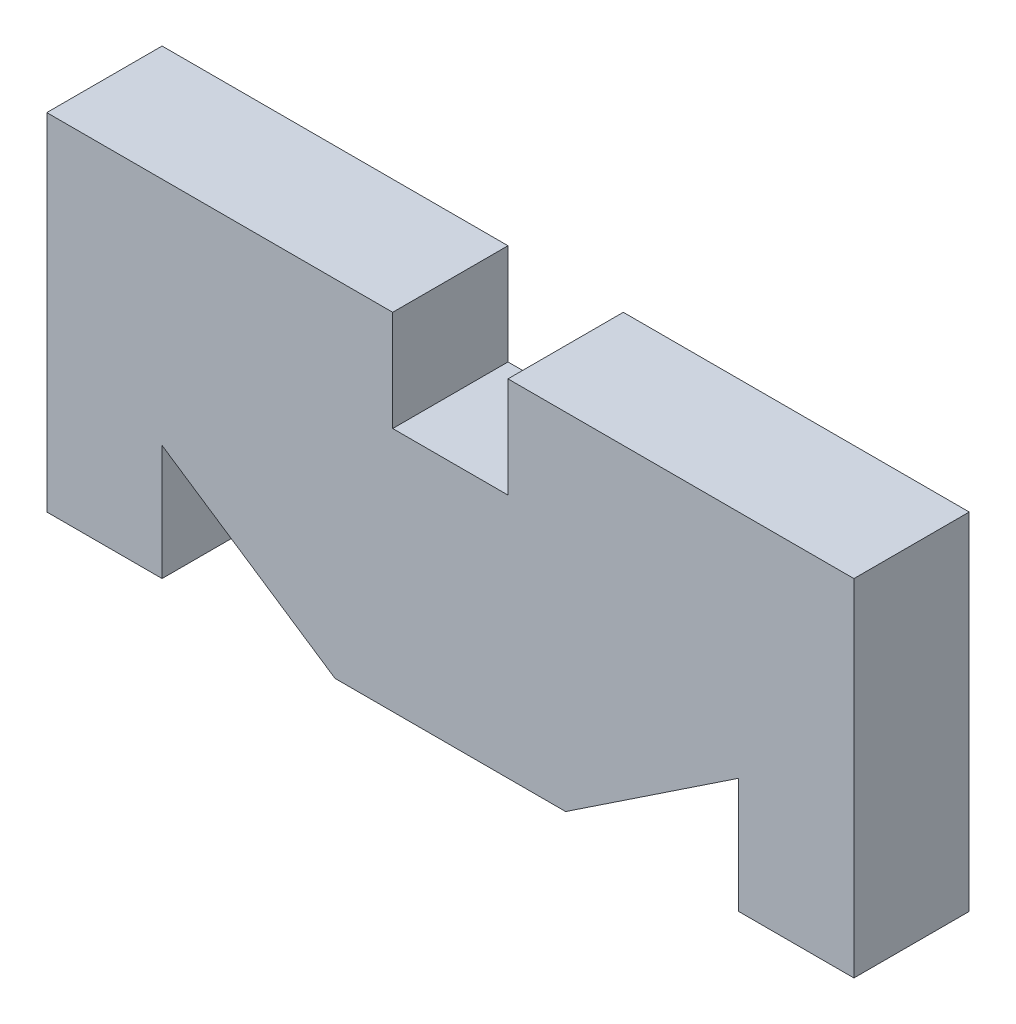
ISO-10303-21;
HEADER;
FILE_DESCRIPTION(('STEP AP214'),'2;1');
FILE_NAME('part.step','',(''),(''),'','','');
FILE_SCHEMA(('AUTOMOTIVE_DESIGN { 1 0 10303 214 1 1 1 1 }'));
ENDSEC;
DATA;
#1=APPLICATION_CONTEXT('core data for automotive mechanical design processes');
#2=APPLICATION_PROTOCOL_DEFINITION('international standard','automotive_design',2000,#1);
#3=PRODUCT_CONTEXT('',#1,'mechanical');
#4=PRODUCT('Part','Part','',(#3));
#5=PRODUCT_RELATED_PRODUCT_CATEGORY('part','',(#4));
#6=PRODUCT_DEFINITION_FORMATION('','',#4);
#7=PRODUCT_DEFINITION_CONTEXT('part definition',#1,'design');
#8=PRODUCT_DEFINITION('design','',#6,#7);
#9=PRODUCT_DEFINITION_SHAPE('','',#8);
#10=(LENGTH_UNIT() NAMED_UNIT(*) SI_UNIT(.MILLI.,.METRE.));
#11=(NAMED_UNIT(*) PLANE_ANGLE_UNIT() SI_UNIT($,.RADIAN.));
#12=(NAMED_UNIT(*) SI_UNIT($,.STERADIAN.) SOLID_ANGLE_UNIT());
#13=UNCERTAINTY_MEASURE_WITH_UNIT(LENGTH_MEASURE(1.E-05),#10,'distance_accuracy_value','');
#14=(GEOMETRIC_REPRESENTATION_CONTEXT(3) GLOBAL_UNCERTAINTY_ASSIGNED_CONTEXT((#13)) GLOBAL_UNIT_ASSIGNED_CONTEXT((#10,
#11,#12)) REPRESENTATION_CONTEXT('',''));
#15=CARTESIAN_POINT('',(0.,0.,0.));
#16=DIRECTION('',(0.,0.,1.));
#17=DIRECTION('',(1.,0.,0.));
#18=AXIS2_PLACEMENT_3D('',#15,#16,#17);
#19=CARTESIAN_POINT('',(-35.0374750143182,19.,10.));
#20=DIRECTION('',(1.,0.,0.));
#21=DIRECTION('',(0.,0.,-1.));
#22=AXIS2_PLACEMENT_3D('',#19,#20,#21);
#23=PLANE('',#22);
#24=DIRECTION('',(0.,-1.,0.));
#25=VECTOR('',#24,1.);
#26=CARTESIAN_POINT('',(-35.0374750143182,19.,0.));
#27=LINE('',#26,#25);
#28=CARTESIAN_POINT('',(-35.0374750143182,19.,0.));
#29=VERTEX_POINT('',#28);
#30=CARTESIAN_POINT('',(-35.0374750143182,-11.,0.));
#31=VERTEX_POINT('',#30);
#32=EDGE_CURVE('E167',#29,#31,#27,.T.);
#33=ORIENTED_EDGE('',*,*,#32,.T.);
#34=DIRECTION('',(0.,0.,-1.));
#35=VECTOR('',#34,1.);
#36=CARTESIAN_POINT('',(-35.0374750143182,-11.,10.));
#37=LINE('',#36,#35);
#38=CARTESIAN_POINT('',(-35.0374750143182,-11.,10.));
#39=VERTEX_POINT('',#38);
#40=EDGE_CURVE('E11',#39,#31,#37,.T.);
#41=ORIENTED_EDGE('',*,*,#40,.F.);
#42=DIRECTION('',(0.,-1.,0.));
#43=VECTOR('',#42,1.);
#44=CARTESIAN_POINT('',(-35.0374750143182,19.,10.));
#45=LINE('',#44,#43);
#46=CARTESIAN_POINT('',(-35.0374750143182,19.,10.));
#47=VERTEX_POINT('',#46);
#48=EDGE_CURVE('E193',#47,#39,#45,.T.);
#49=ORIENTED_EDGE('',*,*,#48,.F.);
#50=DIRECTION('',(0.,0.,-1.));
#51=VECTOR('',#50,1.);
#52=CARTESIAN_POINT('',(-35.0374750143182,19.,10.));
#53=LINE('',#52,#51);
#54=EDGE_CURVE('E163',#47,#29,#53,.T.);
#55=ORIENTED_EDGE('',*,*,#54,.T.);
#56=EDGE_LOOP('',(#33,#41,#49,#55));
#57=FACE_BOUND('',#56,.T.);
#58=ADVANCED_FACE('F35',(#57),#23,.F.);
#59=CARTESIAN_POINT('',(-35.0374750143182,-11.,10.));
#60=DIRECTION('',(0.,1.,0.));
#61=DIRECTION('',(0.,0.,1.));
#62=AXIS2_PLACEMENT_3D('',#59,#60,#61);
#63=PLANE('',#62);
#64=DIRECTION('',(1.,0.,0.));
#65=VECTOR('',#64,1.);
#66=CARTESIAN_POINT('',(-35.0374750143182,-11.,0.));
#67=LINE('',#66,#65);
#68=CARTESIAN_POINT('',(-25.0374750143182,-11.,0.));
#69=VERTEX_POINT('',#68);
#70=EDGE_CURVE('E170',#31,#69,#67,.T.);
#71=ORIENTED_EDGE('',*,*,#70,.T.);
#72=DIRECTION('',(0.,0.,-1.));
#73=VECTOR('',#72,1.);
#74=CARTESIAN_POINT('',(-25.0374750143182,-11.,10.));
#75=LINE('',#74,#73);
#76=CARTESIAN_POINT('',(-25.0374750143182,-11.,10.));
#77=VERTEX_POINT('',#76);
#78=EDGE_CURVE('E43',#77,#69,#75,.T.);
#79=ORIENTED_EDGE('',*,*,#78,.F.);
#80=DIRECTION('',(1.,0.,0.));
#81=VECTOR('',#80,1.);
#82=CARTESIAN_POINT('',(-35.0374750143182,-11.,10.));
#83=LINE('',#82,#81);
#84=EDGE_CURVE('E112',#39,#77,#83,.T.);
#85=ORIENTED_EDGE('',*,*,#84,.F.);
#86=ORIENTED_EDGE('',*,*,#40,.T.);
#87=EDGE_LOOP('',(#71,#79,#85,#86));
#88=FACE_BOUND('',#87,.T.);
#89=ADVANCED_FACE('F281',(#88),#63,.F.);
#90=CARTESIAN_POINT('',(-25.0374750143182,-11.,10.));
#91=DIRECTION('',(-1.,0.,0.));
#92=DIRECTION('',(0.,0.,1.));
#93=AXIS2_PLACEMENT_3D('',#90,#91,#92);
#94=PLANE('',#93);
#95=DIRECTION('',(0.,1.,0.));
#96=VECTOR('',#95,1.);
#97=CARTESIAN_POINT('',(-25.0374750143182,-11.,0.));
#98=LINE('',#97,#96);
#99=CARTESIAN_POINT('',(-25.0374750143182,-0.999999999999996,0.));
#100=VERTEX_POINT('',#99);
#101=EDGE_CURVE('E172',#69,#100,#98,.T.);
#102=ORIENTED_EDGE('',*,*,#101,.T.);
#103=DIRECTION('',(0.,0.,-1.));
#104=VECTOR('',#103,1.);
#105=CARTESIAN_POINT('',(-25.0374750143182,-0.999999999999996,10.));
#106=LINE('',#105,#104);
#107=CARTESIAN_POINT('',(-25.0374750143182,-0.999999999999996,10.));
#108=VERTEX_POINT('',#107);
#109=EDGE_CURVE('E218',#108,#100,#106,.T.);
#110=ORIENTED_EDGE('',*,*,#109,.F.);
#111=DIRECTION('',(0.,1.,0.));
#112=VECTOR('',#111,1.);
#113=CARTESIAN_POINT('',(-25.0374750143182,-11.,10.));
#114=LINE('',#113,#112);
#115=EDGE_CURVE('E226',#77,#108,#114,.T.);
#116=ORIENTED_EDGE('',*,*,#115,.F.);
#117=ORIENTED_EDGE('',*,*,#78,.T.);
#118=EDGE_LOOP('',(#102,#110,#116,#117));
#119=FACE_BOUND('',#118,.T.);
#120=ADVANCED_FACE('F224',(#119),#94,.F.);
#121=CARTESIAN_POINT('',(-25.0374750143182,-0.999999999999996,10.));
#122=DIRECTION('',(0.554700196225229,0.832050294337844,0.));
#123=DIRECTION('',(-0.832050294337844,0.554700196225229,0.));
#124=AXIS2_PLACEMENT_3D('',#121,#122,#123);
#125=PLANE('',#124);
#126=DIRECTION('',(0.832050294337844,-0.554700196225229,0.));
#127=VECTOR('',#126,1.);
#128=CARTESIAN_POINT('',(-25.0374750143182,-0.999999999999996,0.));
#129=LINE('',#128,#127);
#130=CARTESIAN_POINT('',(-10.0374750143182,-11.,0.));
#131=VERTEX_POINT('',#130);
#132=EDGE_CURVE('E174',#100,#131,#129,.T.);
#133=ORIENTED_EDGE('',*,*,#132,.T.);
#134=DIRECTION('',(0.,0.,-1.));
#135=VECTOR('',#134,1.);
#136=CARTESIAN_POINT('',(-10.0374750143182,-11.,10.));
#137=LINE('',#136,#135);
#138=CARTESIAN_POINT('',(-10.0374750143182,-11.,10.));
#139=VERTEX_POINT('',#138);
#140=EDGE_CURVE('E215',#139,#131,#137,.T.);
#141=ORIENTED_EDGE('',*,*,#140,.F.);
#142=DIRECTION('',(0.832050294337844,-0.554700196225229,0.));
#143=VECTOR('',#142,1.);
#144=CARTESIAN_POINT('',(-25.0374750143182,-0.999999999999996,10.));
#145=LINE('',#144,#143);
#146=EDGE_CURVE('E244',#108,#139,#145,.T.);
#147=ORIENTED_EDGE('',*,*,#146,.F.);
#148=ORIENTED_EDGE('',*,*,#109,.T.);
#149=EDGE_LOOP('',(#133,#141,#147,#148));
#150=FACE_BOUND('',#149,.T.);
#151=ADVANCED_FACE('F235',(#150),#125,.F.);
#152=CARTESIAN_POINT('',(-10.0374750143182,-11.,10.));
#153=DIRECTION('',(0.,1.,0.));
#154=DIRECTION('',(0.,0.,1.));
#155=AXIS2_PLACEMENT_3D('',#152,#153,#154);
#156=PLANE('',#155);
#157=DIRECTION('',(1.,0.,0.));
#158=VECTOR('',#157,1.);
#159=CARTESIAN_POINT('',(-10.0374750143182,-11.,0.));
#160=LINE('',#159,#158);
#161=CARTESIAN_POINT('',(9.96252498568179,-11.,0.));
#162=VERTEX_POINT('',#161);
#163=EDGE_CURVE('E176',#131,#162,#160,.T.);
#164=ORIENTED_EDGE('',*,*,#163,.T.);
#165=DIRECTION('',(0.,0.,-1.));
#166=VECTOR('',#165,1.);
#167=CARTESIAN_POINT('',(9.96252498568179,-11.,10.));
#168=LINE('',#167,#166);
#169=CARTESIAN_POINT('',(9.96252498568179,-11.,10.));
#170=VERTEX_POINT('',#169);
#171=EDGE_CURVE('E212',#170,#162,#168,.T.);
#172=ORIENTED_EDGE('',*,*,#171,.F.);
#173=DIRECTION('',(1.,0.,0.));
#174=VECTOR('',#173,1.);
#175=CARTESIAN_POINT('',(-10.0374750143182,-11.,10.));
#176=LINE('',#175,#174);
#177=EDGE_CURVE('E241',#139,#170,#176,.T.);
#178=ORIENTED_EDGE('',*,*,#177,.F.);
#179=ORIENTED_EDGE('',*,*,#140,.T.);
#180=EDGE_LOOP('',(#164,#172,#178,#179));
#181=FACE_BOUND('',#180,.T.);
#182=ADVANCED_FACE('F239',(#181),#156,.F.);
#183=CARTESIAN_POINT('',(24.9625249856818,-0.999999999999996,10.));
#184=DIRECTION('',(-0.554700196225229,0.832050294337844,0.));
#185=DIRECTION('',(-0.832050294337844,-0.554700196225229,0.));
#186=AXIS2_PLACEMENT_3D('',#183,#184,#185);
#187=PLANE('',#186);
#188=DIRECTION('',(0.832050294337844,0.554700196225229,0.));
#189=VECTOR('',#188,1.);
#190=CARTESIAN_POINT('',(24.9625249856818,-0.999999999999996,0.));
#191=LINE('',#190,#189);
#192=CARTESIAN_POINT('',(24.9625249856818,-0.999999999999996,0.));
#193=VERTEX_POINT('',#192);
#194=EDGE_CURVE('E178',#162,#193,#191,.T.);
#195=ORIENTED_EDGE('',*,*,#194,.T.);
#196=DIRECTION('',(0.,0.,-1.));
#197=VECTOR('',#196,1.);
#198=CARTESIAN_POINT('',(24.9625249856818,-0.999999999999996,10.));
#199=LINE('',#198,#197);
#200=CARTESIAN_POINT('',(24.9625249856818,-0.999999999999996,10.));
#201=VERTEX_POINT('',#200);
#202=EDGE_CURVE('E209',#201,#193,#199,.T.);
#203=ORIENTED_EDGE('',*,*,#202,.F.);
#204=DIRECTION('',(0.832050294337844,0.554700196225229,0.));
#205=VECTOR('',#204,1.);
#206=CARTESIAN_POINT('',(24.9625249856818,-0.999999999999996,10.));
#207=LINE('',#206,#205);
#208=EDGE_CURVE('E243',#170,#201,#207,.T.);
#209=ORIENTED_EDGE('',*,*,#208,.F.);
#210=ORIENTED_EDGE('',*,*,#171,.T.);
#211=EDGE_LOOP('',(#195,#203,#209,#210));
#212=FACE_BOUND('',#211,.T.);
#213=ADVANCED_FACE('F294',(#212),#187,.F.);
#214=CARTESIAN_POINT('',(24.9625249856818,-11.,10.));
#215=DIRECTION('',(1.,0.,0.));
#216=DIRECTION('',(0.,0.,-1.));
#217=AXIS2_PLACEMENT_3D('',#214,#215,#216);
#218=PLANE('',#217);
#219=DIRECTION('',(0.,-1.,0.));
#220=VECTOR('',#219,1.);
#221=CARTESIAN_POINT('',(24.9625249856818,-11.,0.));
#222=LINE('',#221,#220);
#223=CARTESIAN_POINT('',(24.9625249856818,-11.,0.));
#224=VERTEX_POINT('',#223);
#225=EDGE_CURVE('E180',#193,#224,#222,.T.);
#226=ORIENTED_EDGE('',*,*,#225,.T.);
#227=DIRECTION('',(0.,0.,-1.));
#228=VECTOR('',#227,1.);
#229=CARTESIAN_POINT('',(24.9625249856818,-11.,10.));
#230=LINE('',#229,#228);
#231=CARTESIAN_POINT('',(24.9625249856818,-11.,10.));
#232=VERTEX_POINT('',#231);
#233=EDGE_CURVE('E206',#232,#224,#230,.T.);
#234=ORIENTED_EDGE('',*,*,#233,.F.);
#235=DIRECTION('',(0.,-1.,0.));
#236=VECTOR('',#235,1.);
#237=CARTESIAN_POINT('',(24.9625249856818,-11.,10.));
#238=LINE('',#237,#236);
#239=EDGE_CURVE('E246',#201,#232,#238,.T.);
#240=ORIENTED_EDGE('',*,*,#239,.F.);
#241=ORIENTED_EDGE('',*,*,#202,.T.);
#242=EDGE_LOOP('',(#226,#234,#240,#241));
#243=FACE_BOUND('',#242,.T.);
#244=ADVANCED_FACE('F297',(#243),#218,.F.);
#245=CARTESIAN_POINT('',(24.9625249856818,-11.,10.));
#246=DIRECTION('',(0.,1.,0.));
#247=DIRECTION('',(0.,0.,1.));
#248=AXIS2_PLACEMENT_3D('',#245,#246,#247);
#249=PLANE('',#248);
#250=DIRECTION('',(1.,0.,0.));
#251=VECTOR('',#250,1.);
#252=CARTESIAN_POINT('',(24.9625249856818,-11.,0.));
#253=LINE('',#252,#251);
#254=CARTESIAN_POINT('',(34.9625249856818,-11.,0.));
#255=VERTEX_POINT('',#254);
#256=EDGE_CURVE('E182',#224,#255,#253,.T.);
#257=ORIENTED_EDGE('',*,*,#256,.T.);
#258=DIRECTION('',(0.,0.,-1.));
#259=VECTOR('',#258,1.);
#260=CARTESIAN_POINT('',(34.9625249856818,-11.,10.));
#261=LINE('',#260,#259);
#262=CARTESIAN_POINT('',(34.9625249856818,-11.,10.));
#263=VERTEX_POINT('',#262);
#264=EDGE_CURVE('E203',#263,#255,#261,.T.);
#265=ORIENTED_EDGE('',*,*,#264,.F.);
#266=DIRECTION('',(1.,0.,0.));
#267=VECTOR('',#266,1.);
#268=CARTESIAN_POINT('',(24.9625249856818,-11.,10.));
#269=LINE('',#268,#267);
#270=EDGE_CURVE('E252',#232,#263,#269,.T.);
#271=ORIENTED_EDGE('',*,*,#270,.F.);
#272=ORIENTED_EDGE('',*,*,#233,.T.);
#273=EDGE_LOOP('',(#257,#265,#271,#272));
#274=FACE_BOUND('',#273,.T.);
#275=ADVANCED_FACE('F301',(#274),#249,.F.);
#276=CARTESIAN_POINT('',(34.9625249856818,19.,10.));
#277=DIRECTION('',(-1.,0.,0.));
#278=DIRECTION('',(0.,-1.,0.));
#279=AXIS2_PLACEMENT_3D('',#276,#277,#278);
#280=PLANE('',#279);
#281=DIRECTION('',(0.,1.,0.));
#282=VECTOR('',#281,1.);
#283=CARTESIAN_POINT('',(34.9625249856818,19.,0.));
#284=LINE('',#283,#282);
#285=CARTESIAN_POINT('',(34.9625249856818,19.,0.));
#286=VERTEX_POINT('',#285);
#287=EDGE_CURVE('E184',#255,#286,#284,.T.);
#288=ORIENTED_EDGE('',*,*,#287,.T.);
#289=DIRECTION('',(0.,0.,-1.));
#290=VECTOR('',#289,1.);
#291=CARTESIAN_POINT('',(34.9625249856818,19.,10.));
#292=LINE('',#291,#290);
#293=CARTESIAN_POINT('',(34.9625249856818,19.,10.));
#294=VERTEX_POINT('',#293);
#295=EDGE_CURVE('E200',#294,#286,#292,.T.);
#296=ORIENTED_EDGE('',*,*,#295,.F.);
#297=DIRECTION('',(0.,1.,0.));
#298=VECTOR('',#297,1.);
#299=CARTESIAN_POINT('',(34.9625249856818,19.,10.));
#300=LINE('',#299,#298);
#301=EDGE_CURVE('E254',#263,#294,#300,.T.);
#302=ORIENTED_EDGE('',*,*,#301,.F.);
#303=ORIENTED_EDGE('',*,*,#264,.T.);
#304=EDGE_LOOP('',(#288,#296,#302,#303));
#305=FACE_BOUND('',#304,.T.);
#306=ADVANCED_FACE('F305',(#305),#280,.F.);
#307=CARTESIAN_POINT('',(4.96252498568178,19.,10.));
#308=DIRECTION('',(0.,-1.,0.));
#309=DIRECTION('',(0.,0.,-1.));
#310=AXIS2_PLACEMENT_3D('',#307,#308,#309);
#311=PLANE('',#310);
#312=DIRECTION('',(-1.,0.,0.));
#313=VECTOR('',#312,1.);
#314=CARTESIAN_POINT('',(4.96252498568178,19.,0.));
#315=LINE('',#314,#313);
#316=CARTESIAN_POINT('',(4.96252498568178,19.,0.));
#317=VERTEX_POINT('',#316);
#318=EDGE_CURVE('E186',#286,#317,#315,.T.);
#319=ORIENTED_EDGE('',*,*,#318,.T.);
#320=DIRECTION('',(0.,0.,-1.));
#321=VECTOR('',#320,1.);
#322=CARTESIAN_POINT('',(4.96252498568178,19.,10.));
#323=LINE('',#322,#321);
#324=CARTESIAN_POINT('',(4.96252498568178,19.,10.));
#325=VERTEX_POINT('',#324);
#326=EDGE_CURVE('E197',#325,#317,#323,.T.);
#327=ORIENTED_EDGE('',*,*,#326,.F.);
#328=DIRECTION('',(-1.,0.,0.));
#329=VECTOR('',#328,1.);
#330=CARTESIAN_POINT('',(4.96252498568178,19.,10.));
#331=LINE('',#330,#329);
#332=EDGE_CURVE('E256',#294,#325,#331,.T.);
#333=ORIENTED_EDGE('',*,*,#332,.F.);
#334=ORIENTED_EDGE('',*,*,#295,.T.);
#335=EDGE_LOOP('',(#319,#327,#333,#334));
#336=FACE_BOUND('',#335,.T.);
#337=ADVANCED_FACE('F262',(#336),#311,.F.);
#338=CARTESIAN_POINT('',(4.96252498568178,10.2697729322163,10.));
#339=DIRECTION('',(1.,0.,0.));
#340=DIRECTION('',(0.,0.,-1.));
#341=AXIS2_PLACEMENT_3D('',#338,#339,#340);
#342=PLANE('',#341);
#343=DIRECTION('',(0.,-1.,0.));
#344=VECTOR('',#343,1.);
#345=CARTESIAN_POINT('',(4.96252498568178,10.2697729322163,0.));
#346=LINE('',#345,#344);
#347=CARTESIAN_POINT('',(4.96252498568178,10.2697729322163,0.));
#348=VERTEX_POINT('',#347);
#349=EDGE_CURVE('E188',#317,#348,#346,.T.);
#350=ORIENTED_EDGE('',*,*,#349,.T.);
#351=DIRECTION('',(0.,0.,-1.));
#352=VECTOR('',#351,1.);
#353=CARTESIAN_POINT('',(4.96252498568178,10.2697729322163,10.));
#354=LINE('',#353,#352);
#355=CARTESIAN_POINT('',(4.96252498568178,10.2697729322163,10.));
#356=VERTEX_POINT('',#355);
#357=EDGE_CURVE('E158',#356,#348,#354,.T.);
#358=ORIENTED_EDGE('',*,*,#357,.F.);
#359=DIRECTION('',(0.,-1.,0.));
#360=VECTOR('',#359,1.);
#361=CARTESIAN_POINT('',(4.96252498568178,10.2697729322163,10.));
#362=LINE('',#361,#360);
#363=EDGE_CURVE('E149',#325,#356,#362,.T.);
#364=ORIENTED_EDGE('',*,*,#363,.F.);
#365=ORIENTED_EDGE('',*,*,#326,.T.);
#366=EDGE_LOOP('',(#350,#358,#364,#365));
#367=FACE_BOUND('',#366,.T.);
#368=ADVANCED_FACE('F266',(#367),#342,.F.);
#369=CARTESIAN_POINT('',(-5.03747501431822,10.2697729322163,10.));
#370=DIRECTION('',(0.,-1.,0.));
#371=DIRECTION('',(0.,0.,-1.));
#372=AXIS2_PLACEMENT_3D('',#369,#370,#371);
#373=PLANE('',#372);
#374=DIRECTION('',(-1.,0.,0.));
#375=VECTOR('',#374,1.);
#376=CARTESIAN_POINT('',(-5.03747501431822,10.2697729322163,0.));
#377=LINE('',#376,#375);
#378=CARTESIAN_POINT('',(-5.03747501431822,10.2697729322163,0.));
#379=VERTEX_POINT('',#378);
#380=EDGE_CURVE('E157',#348,#379,#377,.T.);
#381=ORIENTED_EDGE('',*,*,#380,.T.);
#382=DIRECTION('',(0.,0.,-1.));
#383=VECTOR('',#382,1.);
#384=CARTESIAN_POINT('',(-5.03747501431822,10.2697729322163,10.));
#385=LINE('',#384,#383);
#386=CARTESIAN_POINT('',(-5.03747501431822,10.2697729322163,10.));
#387=VERTEX_POINT('',#386);
#388=EDGE_CURVE('E154',#387,#379,#385,.T.);
#389=ORIENTED_EDGE('',*,*,#388,.F.);
#390=DIRECTION('',(-1.,0.,0.));
#391=VECTOR('',#390,1.);
#392=CARTESIAN_POINT('',(-5.03747501431822,10.2697729322163,10.));
#393=LINE('',#392,#391);
#394=EDGE_CURVE('E143',#356,#387,#393,.T.);
#395=ORIENTED_EDGE('',*,*,#394,.F.);
#396=ORIENTED_EDGE('',*,*,#357,.T.);
#397=EDGE_LOOP('',(#381,#389,#395,#396));
#398=FACE_BOUND('',#397,.T.);
#399=ADVANCED_FACE('F155',(#398),#373,.F.);
#400=CARTESIAN_POINT('',(-5.03747501431822,19.,10.));
#401=DIRECTION('',(-1.,0.,0.));
#402=DIRECTION('',(0.,-1.,0.));
#403=AXIS2_PLACEMENT_3D('',#400,#401,#402);
#404=PLANE('',#403);
#405=DIRECTION('',(0.,1.,0.));
#406=VECTOR('',#405,1.);
#407=CARTESIAN_POINT('',(-5.03747501431822,19.,0.));
#408=LINE('',#407,#406);
#409=CARTESIAN_POINT('',(-5.03747501431822,19.,0.));
#410=VERTEX_POINT('',#409);
#411=EDGE_CURVE('E98',#379,#410,#408,.T.);
#412=ORIENTED_EDGE('',*,*,#411,.T.);
#413=DIRECTION('',(0.,0.,-1.));
#414=VECTOR('',#413,1.);
#415=CARTESIAN_POINT('',(-5.03747501431822,19.,10.));
#416=LINE('',#415,#414);
#417=CARTESIAN_POINT('',(-5.03747501431822,19.,10.));
#418=VERTEX_POINT('',#417);
#419=EDGE_CURVE('E159',#418,#410,#416,.T.);
#420=ORIENTED_EDGE('',*,*,#419,.F.);
#421=DIRECTION('',(0.,1.,0.));
#422=VECTOR('',#421,1.);
#423=CARTESIAN_POINT('',(-5.03747501431822,19.,10.));
#424=LINE('',#423,#422);
#425=EDGE_CURVE('E147',#387,#418,#424,.T.);
#426=ORIENTED_EDGE('',*,*,#425,.F.);
#427=ORIENTED_EDGE('',*,*,#388,.T.);
#428=EDGE_LOOP('',(#412,#420,#426,#427));
#429=FACE_BOUND('',#428,.T.);
#430=ADVANCED_FACE('F161',(#429),#404,.F.);
#431=CARTESIAN_POINT('',(-35.0374750143182,19.,10.));
#432=DIRECTION('',(0.,-1.,0.));
#433=DIRECTION('',(0.,0.,-1.));
#434=AXIS2_PLACEMENT_3D('',#431,#432,#433);
#435=PLANE('',#434);
#436=DIRECTION('',(-1.,0.,0.));
#437=VECTOR('',#436,1.);
#438=CARTESIAN_POINT('',(-35.0374750143182,19.,0.));
#439=LINE('',#438,#437);
#440=EDGE_CURVE('E104',#410,#29,#439,.T.);
#441=ORIENTED_EDGE('',*,*,#440,.T.);
#442=ORIENTED_EDGE('',*,*,#54,.F.);
#443=DIRECTION('',(-1.,0.,0.));
#444=VECTOR('',#443,1.);
#445=CARTESIAN_POINT('',(-35.0374750143182,19.,10.));
#446=LINE('',#445,#444);
#447=EDGE_CURVE('E51',#418,#47,#446,.T.);
#448=ORIENTED_EDGE('',*,*,#447,.F.);
#449=ORIENTED_EDGE('',*,*,#419,.T.);
#450=EDGE_LOOP('',(#441,#442,#448,#449));
#451=FACE_BOUND('',#450,.T.);
#452=ADVANCED_FACE('F270',(#451),#435,.F.);
#453=CARTESIAN_POINT('',(0.,0.,10.));
#454=DIRECTION('',(0.,0.,1.));
#455=DIRECTION('',(1.,0.,0.));
#456=AXIS2_PLACEMENT_3D('',#453,#454,#455);
#457=PLANE('',#456);
#458=ORIENTED_EDGE('',*,*,#48,.T.);
#459=ORIENTED_EDGE('',*,*,#84,.T.);
#460=ORIENTED_EDGE('',*,*,#115,.T.);
#461=ORIENTED_EDGE('',*,*,#146,.T.);
#462=ORIENTED_EDGE('',*,*,#177,.T.);
#463=ORIENTED_EDGE('',*,*,#208,.T.);
#464=ORIENTED_EDGE('',*,*,#239,.T.);
#465=ORIENTED_EDGE('',*,*,#270,.T.);
#466=ORIENTED_EDGE('',*,*,#301,.T.);
#467=ORIENTED_EDGE('',*,*,#332,.T.);
#468=ORIENTED_EDGE('',*,*,#363,.T.);
#469=ORIENTED_EDGE('',*,*,#394,.T.);
#470=ORIENTED_EDGE('',*,*,#425,.T.);
#471=ORIENTED_EDGE('',*,*,#447,.T.);
#472=EDGE_LOOP('',(#458,#459,#460,#461,#462,#463,#464,#465,#466,#467,#468,#469,#470,#471));
#473=FACE_BOUND('',#472,.T.);
#474=ADVANCED_FACE('F145',(#473),#457,.T.);
#475=CARTESIAN_POINT('',(0.,0.,0.));
#476=DIRECTION('',(0.,0.,1.));
#477=DIRECTION('',(1.,0.,0.));
#478=AXIS2_PLACEMENT_3D('',#475,#476,#477);
#479=PLANE('',#478);
#480=ORIENTED_EDGE('',*,*,#32,.F.);
#481=ORIENTED_EDGE('',*,*,#440,.F.);
#482=ORIENTED_EDGE('',*,*,#411,.F.);
#483=ORIENTED_EDGE('',*,*,#380,.F.);
#484=ORIENTED_EDGE('',*,*,#349,.F.);
#485=ORIENTED_EDGE('',*,*,#318,.F.);
#486=ORIENTED_EDGE('',*,*,#287,.F.);
#487=ORIENTED_EDGE('',*,*,#256,.F.);
#488=ORIENTED_EDGE('',*,*,#225,.F.);
#489=ORIENTED_EDGE('',*,*,#194,.F.);
#490=ORIENTED_EDGE('',*,*,#163,.F.);
#491=ORIENTED_EDGE('',*,*,#132,.F.);
#492=ORIENTED_EDGE('',*,*,#101,.F.);
#493=ORIENTED_EDGE('',*,*,#70,.F.);
#494=EDGE_LOOP('',(#480,#481,#482,#483,#484,#485,#486,#487,#488,#489,#490,#491,#492,#493));
#495=FACE_BOUND('',#494,.T.);
#496=ADVANCED_FACE('F230',(#495),#479,.F.);
#497=CLOSED_SHELL('',(#58,#89,#120,#151,#182,#213,#244,#275,#306,#337,#368,#399,#430,#452,#474,#496));
#498=MANIFOLD_SOLID_BREP('B2',#497);
#499=ADVANCED_BREP_SHAPE_REPRESENTATION('',(#18,#498),#14);
#500=SHAPE_DEFINITION_REPRESENTATION(#9,#499);
ENDSEC;
END-ISO-10303-21;
